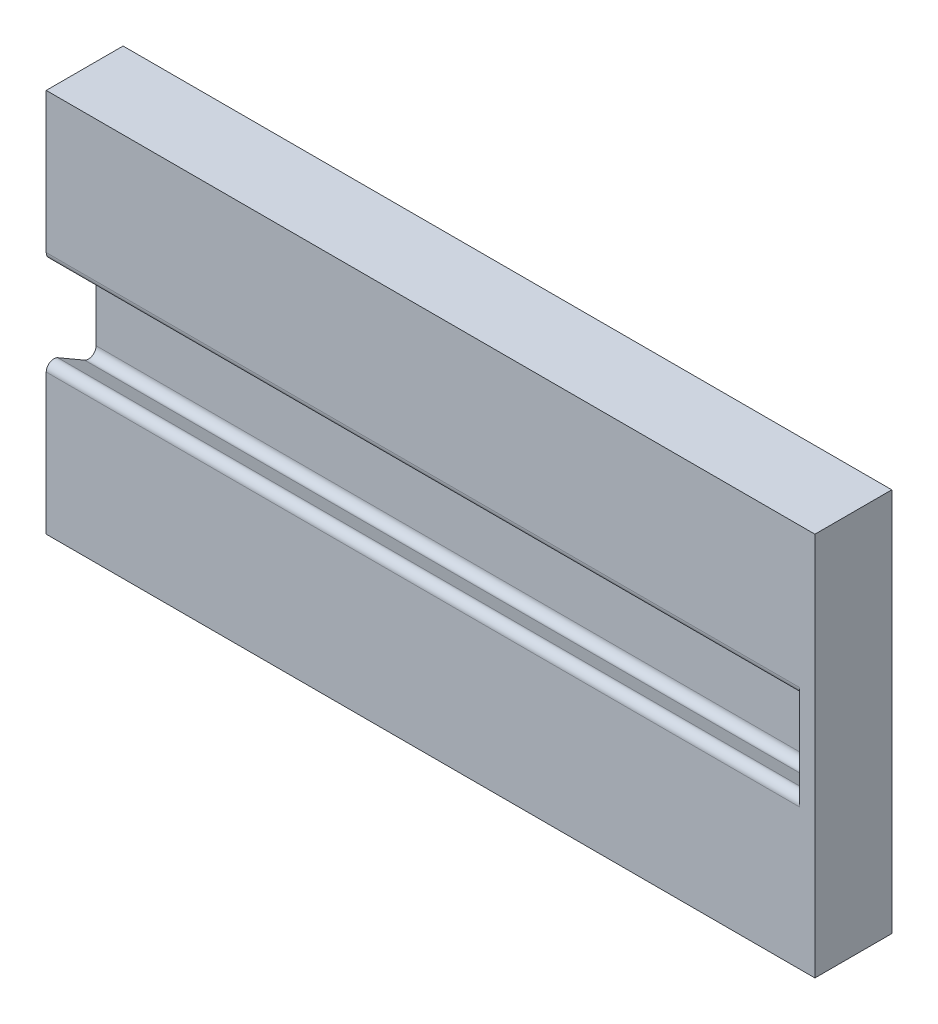
ISO-10303-21;
HEADER;
FILE_DESCRIPTION(('STEP AP214'),'2;1');
FILE_NAME('part.step','',(''),(''),'','','');
FILE_SCHEMA(('AUTOMOTIVE_DESIGN { 1 0 10303 214 1 1 1 1 }'));
ENDSEC;
DATA;
#1=APPLICATION_CONTEXT('core data for automotive mechanical design processes');
#2=APPLICATION_PROTOCOL_DEFINITION('international standard','automotive_design',2000,#1);
#3=PRODUCT_CONTEXT('',#1,'mechanical');
#4=PRODUCT('Part','Part','',(#3));
#5=PRODUCT_RELATED_PRODUCT_CATEGORY('part','',(#4));
#6=PRODUCT_DEFINITION_FORMATION('','',#4);
#7=PRODUCT_DEFINITION_CONTEXT('part definition',#1,'design');
#8=PRODUCT_DEFINITION('design','',#6,#7);
#9=PRODUCT_DEFINITION_SHAPE('','',#8);
#10=(LENGTH_UNIT() NAMED_UNIT(*) SI_UNIT(.MILLI.,.METRE.));
#11=(NAMED_UNIT(*) PLANE_ANGLE_UNIT() SI_UNIT($,.RADIAN.));
#12=(NAMED_UNIT(*) SI_UNIT($,.STERADIAN.) SOLID_ANGLE_UNIT());
#13=UNCERTAINTY_MEASURE_WITH_UNIT(LENGTH_MEASURE(1.E-05),#10,'distance_accuracy_value','');
#14=(GEOMETRIC_REPRESENTATION_CONTEXT(3) GLOBAL_UNCERTAINTY_ASSIGNED_CONTEXT((#13)) GLOBAL_UNIT_ASSIGNED_CONTEXT((#10,
#11,#12)) REPRESENTATION_CONTEXT('',''));
#15=CARTESIAN_POINT('',(0.,0.,0.));
#16=DIRECTION('',(0.,0.,1.));
#17=DIRECTION('',(1.,0.,0.));
#18=AXIS2_PLACEMENT_3D('',#15,#16,#17);
#19=CARTESIAN_POINT('',(50.,25.,10.));
#20=DIRECTION('',(-1.,0.,0.));
#21=DIRECTION('',(0.,-1.,0.));
#22=AXIS2_PLACEMENT_3D('',#19,#20,#21);
#23=PLANE('',#22);
#24=DIRECTION('',(0.,1.,0.));
#25=VECTOR('',#24,1.);
#26=CARTESIAN_POINT('',(50.,25.,0.));
#27=LINE('',#26,#25);
#28=CARTESIAN_POINT('',(50.,-25.,0.));
#29=VERTEX_POINT('',#28);
#30=CARTESIAN_POINT('',(50.,25.,0.));
#31=VERTEX_POINT('',#30);
#32=EDGE_CURVE('E145',#29,#31,#27,.T.);
#33=ORIENTED_EDGE('',*,*,#32,.T.);
#34=DIRECTION('',(0.,0.,-1.));
#35=VECTOR('',#34,1.);
#36=CARTESIAN_POINT('',(50.,25.,10.));
#37=LINE('',#36,#35);
#38=CARTESIAN_POINT('',(50.,25.,10.));
#39=VERTEX_POINT('',#38);
#40=EDGE_CURVE('E126',#39,#31,#37,.T.);
#41=ORIENTED_EDGE('',*,*,#40,.F.);
#42=DIRECTION('',(0.,1.,0.));
#43=VECTOR('',#42,1.);
#44=CARTESIAN_POINT('',(50.,25.,10.));
#45=LINE('',#44,#43);
#46=CARTESIAN_POINT('',(50.,-25.,10.));
#47=VERTEX_POINT('',#46);
#48=EDGE_CURVE('E133',#47,#39,#45,.T.);
#49=ORIENTED_EDGE('',*,*,#48,.F.);
#50=DIRECTION('',(0.,0.,-1.));
#51=VECTOR('',#50,1.);
#52=CARTESIAN_POINT('',(50.,-25.,10.));
#53=LINE('',#52,#51);
#54=EDGE_CURVE('E202',#47,#29,#53,.T.);
#55=ORIENTED_EDGE('',*,*,#54,.T.);
#56=EDGE_LOOP('',(#33,#41,#49,#55));
#57=FACE_BOUND('',#56,.T.);
#58=ADVANCED_FACE('F36',(#57),#23,.F.);
#59=CARTESIAN_POINT('',(-50.,25.,10.));
#60=DIRECTION('',(0.,-1.,0.));
#61=DIRECTION('',(0.,0.,-1.));
#62=AXIS2_PLACEMENT_3D('',#59,#60,#61);
#63=PLANE('',#62);
#64=DIRECTION('',(-1.,0.,0.));
#65=VECTOR('',#64,1.);
#66=CARTESIAN_POINT('',(-50.,25.,0.));
#67=LINE('',#66,#65);
#68=CARTESIAN_POINT('',(-50.,25.,0.));
#69=VERTEX_POINT('',#68);
#70=EDGE_CURVE('E204',#31,#69,#67,.T.);
#71=ORIENTED_EDGE('',*,*,#70,.T.);
#72=DIRECTION('',(0.,0.,-1.));
#73=VECTOR('',#72,1.);
#74=CARTESIAN_POINT('',(-50.,25.,10.));
#75=LINE('',#74,#73);
#76=CARTESIAN_POINT('',(-50.,25.,10.));
#77=VERTEX_POINT('',#76);
#78=EDGE_CURVE('E129',#77,#69,#75,.T.);
#79=ORIENTED_EDGE('',*,*,#78,.F.);
#80=DIRECTION('',(-1.,0.,0.));
#81=VECTOR('',#80,1.);
#82=CARTESIAN_POINT('',(-50.,25.,10.));
#83=LINE('',#82,#81);
#84=EDGE_CURVE('E122',#39,#77,#83,.T.);
#85=ORIENTED_EDGE('',*,*,#84,.F.);
#86=ORIENTED_EDGE('',*,*,#40,.T.);
#87=EDGE_LOOP('',(#71,#79,#85,#86));
#88=FACE_BOUND('',#87,.T.);
#89=ADVANCED_FACE('F124',(#88),#63,.F.);
#90=CARTESIAN_POINT('',(-50.,25.,10.));
#91=DIRECTION('',(1.,0.,0.));
#92=DIRECTION('',(0.,0.,-1.));
#93=AXIS2_PLACEMENT_3D('',#90,#91,#92);
#94=PLANE('',#93);
#95=DIRECTION('',(0.,-1.,0.));
#96=VECTOR('',#95,1.);
#97=CARTESIAN_POINT('',(-50.,25.,10.));
#98=LINE('',#97,#96);
#99=CARTESIAN_POINT('',(-50.,-6.73205080756889,10.));
#100=VERTEX_POINT('',#99);
#101=CARTESIAN_POINT('',(-50.,-25.,10.));
#102=VERTEX_POINT('',#101);
#103=EDGE_CURVE('E132',#100,#102,#98,.T.);
#104=ORIENTED_EDGE('',*,*,#103,.F.);
#105=CARTESIAN_POINT('',(-50.,-6.73205080756889,9.));
#106=DIRECTION('',(1.,0.,0.));
#107=DIRECTION('',(0.,0.,-1.));
#108=AXIS2_PLACEMENT_3D('',#105,#106,#107);
#109=CIRCLE('',#108,1.);
#110=CARTESIAN_POINT('',(-50.,-5.86602540378445,8.5));
#111=VERTEX_POINT('',#110);
#112=EDGE_CURVE('E176',#100,#111,#109,.F.);
#113=ORIENTED_EDGE('',*,*,#112,.T.);
#114=DIRECTION('',(0.,0.500000000000004,0.866025403784436));
#115=VECTOR('',#114,1.);
#116=CARTESIAN_POINT('',(-50.,-5.,10.));
#117=LINE('',#116,#115);
#118=CARTESIAN_POINT('',(-50.,-7.88397459621558,5.00480947161673));
#119=VERTEX_POINT('',#118);
#120=EDGE_CURVE('E231',#119,#111,#117,.T.);
#121=ORIENTED_EDGE('',*,*,#120,.F.);
#122=CARTESIAN_POINT('',(-50.,-7.01794919243115,4.50480947161673));
#123=DIRECTION('',(1.,0.,0.));
#124=DIRECTION('',(0.,0.,-1.));
#125=AXIS2_PLACEMENT_3D('',#122,#123,#124);
#126=CIRCLE('',#125,1.);
#127=CARTESIAN_POINT('',(-50.,-7.01794919243115,3.50480947161673));
#128=VERTEX_POINT('',#127);
#129=EDGE_CURVE('E178',#119,#128,#126,.T.);
#130=ORIENTED_EDGE('',*,*,#129,.T.);
#131=DIRECTION('',(0.,-1.,0.));
#132=VECTOR('',#131,1.);
#133=CARTESIAN_POINT('',(-50.,8.75000000000003,3.50480947161673));
#134=LINE('',#133,#132);
#135=CARTESIAN_POINT('',(-50.,7.01794919243114,3.50480947161673));
#136=VERTEX_POINT('',#135);
#137=EDGE_CURVE('E234',#136,#128,#134,.T.);
#138=ORIENTED_EDGE('',*,*,#137,.F.);
#139=CARTESIAN_POINT('',(-50.,7.01794919243114,4.50480947161673));
#140=DIRECTION('',(1.,0.,0.));
#141=DIRECTION('',(0.,0.,-1.));
#142=AXIS2_PLACEMENT_3D('',#139,#140,#141);
#143=CIRCLE('',#142,1.);
#144=CARTESIAN_POINT('',(-50.,7.88397459621558,5.00480947161673));
#145=VERTEX_POINT('',#144);
#146=EDGE_CURVE('E180',#136,#145,#143,.T.);
#147=ORIENTED_EDGE('',*,*,#146,.T.);
#148=DIRECTION('',(0.,0.500000000000004,-0.866025403784436));
#149=VECTOR('',#148,1.);
#150=CARTESIAN_POINT('',(-50.,5.,10.));
#151=LINE('',#150,#149);
#152=CARTESIAN_POINT('',(-50.,5.86602540378445,8.5));
#153=VERTEX_POINT('',#152);
#154=EDGE_CURVE('E237',#153,#145,#151,.T.);
#155=ORIENTED_EDGE('',*,*,#154,.F.);
#156=CARTESIAN_POINT('',(-50.,6.73205080756889,9.));
#157=DIRECTION('',(1.,0.,0.));
#158=DIRECTION('',(0.,0.,-1.));
#159=AXIS2_PLACEMENT_3D('',#156,#157,#158);
#160=CIRCLE('',#159,1.);
#161=CARTESIAN_POINT('',(-50.,6.73205080756889,10.));
#162=VERTEX_POINT('',#161);
#163=EDGE_CURVE('E174',#153,#162,#160,.F.);
#164=ORIENTED_EDGE('',*,*,#163,.T.);
#165=EDGE_CURVE('E198',#77,#162,#98,.T.);
#166=ORIENTED_EDGE('',*,*,#165,.F.);
#167=ORIENTED_EDGE('',*,*,#78,.T.);
#168=DIRECTION('',(0.,-1.,0.));
#169=VECTOR('',#168,1.);
#170=CARTESIAN_POINT('',(-50.,25.,0.));
#171=LINE('',#170,#169);
#172=CARTESIAN_POINT('',(-50.,-25.,0.));
#173=VERTEX_POINT('',#172);
#174=EDGE_CURVE('E207',#69,#173,#171,.T.);
#175=ORIENTED_EDGE('',*,*,#174,.T.);
#176=DIRECTION('',(0.,0.,-1.));
#177=VECTOR('',#176,1.);
#178=CARTESIAN_POINT('',(-50.,-25.,10.));
#179=LINE('',#178,#177);
#180=EDGE_CURVE('E150',#102,#173,#179,.T.);
#181=ORIENTED_EDGE('',*,*,#180,.F.);
#182=EDGE_LOOP('',(#104,#113,#121,#130,#138,#147,#155,#164,#166,#167,#175,#181));
#183=FACE_BOUND('',#182,.T.);
#184=ADVANCED_FACE('F194',(#183),#94,.F.);
#185=CARTESIAN_POINT('',(-50.,-25.,10.));
#186=DIRECTION('',(0.,1.,0.));
#187=DIRECTION('',(0.,0.,1.));
#188=AXIS2_PLACEMENT_3D('',#185,#186,#187);
#189=PLANE('',#188);
#190=DIRECTION('',(1.,0.,0.));
#191=VECTOR('',#190,1.);
#192=CARTESIAN_POINT('',(-50.,-25.,0.));
#193=LINE('',#192,#191);
#194=EDGE_CURVE('E142',#173,#29,#193,.T.);
#195=ORIENTED_EDGE('',*,*,#194,.T.);
#196=ORIENTED_EDGE('',*,*,#54,.F.);
#197=DIRECTION('',(1.,0.,0.));
#198=VECTOR('',#197,1.);
#199=CARTESIAN_POINT('',(-50.,-25.,10.));
#200=LINE('',#199,#198);
#201=EDGE_CURVE('E138',#102,#47,#200,.T.);
#202=ORIENTED_EDGE('',*,*,#201,.F.);
#203=ORIENTED_EDGE('',*,*,#180,.T.);
#204=EDGE_LOOP('',(#195,#196,#202,#203));
#205=FACE_BOUND('',#204,.T.);
#206=ADVANCED_FACE('F212',(#205),#189,.F.);
#207=CARTESIAN_POINT('',(0.,0.,10.));
#208=DIRECTION('',(0.,0.,1.));
#209=DIRECTION('',(1.,0.,0.));
#210=AXIS2_PLACEMENT_3D('',#207,#208,#209);
#211=PLANE('',#210);
#212=DIRECTION('',(0.,-1.,0.));
#213=VECTOR('',#212,1.);
#214=CARTESIAN_POINT('',(48.,-5.,10.));
#215=LINE('',#214,#213);
#216=CARTESIAN_POINT('',(48.,6.73205080756888,10.));
#217=VERTEX_POINT('',#216);
#218=CARTESIAN_POINT('',(48.,-6.73205080756889,10.));
#219=VERTEX_POINT('',#218);
#220=EDGE_CURVE('E51',#217,#219,#215,.T.);
#221=ORIENTED_EDGE('',*,*,#220,.T.);
#222=DIRECTION('',(-1.,0.,0.));
#223=VECTOR('',#222,1.);
#224=CARTESIAN_POINT('',(-50.,-6.73205080756889,10.));
#225=LINE('',#224,#223);
#226=EDGE_CURVE('E172',#219,#100,#225,.T.);
#227=ORIENTED_EDGE('',*,*,#226,.T.);
#228=ORIENTED_EDGE('',*,*,#103,.T.);
#229=ORIENTED_EDGE('',*,*,#201,.T.);
#230=ORIENTED_EDGE('',*,*,#48,.T.);
#231=ORIENTED_EDGE('',*,*,#84,.T.);
#232=ORIENTED_EDGE('',*,*,#165,.T.);
#233=DIRECTION('',(-1.,0.,0.));
#234=VECTOR('',#233,1.);
#235=CARTESIAN_POINT('',(48.,6.73205080756889,10.));
#236=LINE('',#235,#234);
#237=EDGE_CURVE('E170',#162,#217,#236,.F.);
#238=ORIENTED_EDGE('',*,*,#237,.T.);
#239=EDGE_LOOP('',(#221,#227,#228,#229,#230,#231,#232,#238));
#240=FACE_BOUND('',#239,.T.);
#241=ADVANCED_FACE('F136',(#240),#211,.T.);
#242=CARTESIAN_POINT('',(0.,0.,0.));
#243=DIRECTION('',(0.,0.,1.));
#244=DIRECTION('',(1.,0.,0.));
#245=AXIS2_PLACEMENT_3D('',#242,#243,#244);
#246=PLANE('',#245);
#247=ORIENTED_EDGE('',*,*,#32,.F.);
#248=ORIENTED_EDGE('',*,*,#194,.F.);
#249=ORIENTED_EDGE('',*,*,#174,.F.);
#250=ORIENTED_EDGE('',*,*,#70,.F.);
#251=EDGE_LOOP('',(#247,#248,#249,#250));
#252=FACE_BOUND('',#251,.T.);
#253=ADVANCED_FACE('F215',(#252),#246,.F.);
#254=CARTESIAN_POINT('',(68.6664806538352,-5.,10.));
#255=DIRECTION('',(0.,-0.866025403784436,0.500000000000004));
#256=DIRECTION('',(0.,-0.500000000000005,-0.866025403784436));
#257=AXIS2_PLACEMENT_3D('',#254,#255,#256);
#258=PLANE('',#257);
#259=DIRECTION('',(0.,-0.500000000000005,-0.866025403784436));
#260=VECTOR('',#259,1.);
#261=CARTESIAN_POINT('',(48.,-5.,10.));
#262=LINE('',#261,#260);
#263=CARTESIAN_POINT('',(48.,-5.86602540378445,8.5));
#264=VERTEX_POINT('',#263);
#265=CARTESIAN_POINT('',(48.,-7.88397459621558,5.00480947161673));
#266=VERTEX_POINT('',#265);
#267=EDGE_CURVE('E187',#264,#266,#262,.T.);
#268=ORIENTED_EDGE('',*,*,#267,.T.);
#269=DIRECTION('',(-1.,0.,0.));
#270=VECTOR('',#269,1.);
#271=CARTESIAN_POINT('',(-50.,-7.88397459621558,5.00480947161673));
#272=LINE('',#271,#270);
#273=EDGE_CURVE('E148',#266,#119,#272,.T.);
#274=ORIENTED_EDGE('',*,*,#273,.T.);
#275=ORIENTED_EDGE('',*,*,#120,.T.);
#276=DIRECTION('',(-1.,0.,0.));
#277=VECTOR('',#276,1.);
#278=CARTESIAN_POINT('',(48.,-5.86602540378445,8.5));
#279=LINE('',#278,#277);
#280=EDGE_CURVE('E146',#111,#264,#279,.F.);
#281=ORIENTED_EDGE('',*,*,#280,.T.);
#282=EDGE_LOOP('',(#268,#274,#275,#281));
#283=FACE_BOUND('',#282,.T.);
#284=ADVANCED_FACE('F253',(#283),#258,.F.);
#285=CARTESIAN_POINT('',(68.6664806538352,8.75000000000003,3.50480947161673));
#286=DIRECTION('',(0.,0.,-1.));
#287=DIRECTION('',(0.,1.,0.));
#288=AXIS2_PLACEMENT_3D('',#285,#286,#287);
#289=PLANE('',#288);
#290=ORIENTED_EDGE('',*,*,#137,.T.);
#291=DIRECTION('',(-1.,0.,0.));
#292=VECTOR('',#291,1.);
#293=CARTESIAN_POINT('',(48.,-7.01794919243115,3.50480947161673));
#294=LINE('',#293,#292);
#295=CARTESIAN_POINT('',(48.,-7.01794919243115,3.50480947161673));
#296=VERTEX_POINT('',#295);
#297=EDGE_CURVE('E159',#128,#296,#294,.F.);
#298=ORIENTED_EDGE('',*,*,#297,.T.);
#299=DIRECTION('',(0.,1.,0.));
#300=VECTOR('',#299,1.);
#301=CARTESIAN_POINT('',(48.,8.75000000000003,3.50480947161673));
#302=LINE('',#301,#300);
#303=CARTESIAN_POINT('',(48.,7.01794919243114,3.50480947161673));
#304=VERTEX_POINT('',#303);
#305=EDGE_CURVE('E233',#296,#304,#302,.T.);
#306=ORIENTED_EDGE('',*,*,#305,.T.);
#307=DIRECTION('',(-1.,0.,0.));
#308=VECTOR('',#307,1.);
#309=CARTESIAN_POINT('',(-50.,7.01794919243114,3.50480947161673));
#310=LINE('',#309,#308);
#311=EDGE_CURVE('E156',#304,#136,#310,.T.);
#312=ORIENTED_EDGE('',*,*,#311,.T.);
#313=EDGE_LOOP('',(#290,#298,#306,#312));
#314=FACE_BOUND('',#313,.T.);
#315=ADVANCED_FACE('F243',(#314),#289,.F.);
#316=CARTESIAN_POINT('',(68.6664806538352,5.,10.));
#317=DIRECTION('',(0.,0.866025403784436,0.500000000000004));
#318=DIRECTION('',(0.,-0.500000000000004,0.866025403784436));
#319=AXIS2_PLACEMENT_3D('',#316,#317,#318);
#320=PLANE('',#319);
#321=ORIENTED_EDGE('',*,*,#154,.T.);
#322=DIRECTION('',(-1.,0.,0.));
#323=VECTOR('',#322,1.);
#324=CARTESIAN_POINT('',(48.,7.88397459621558,5.00480947161673));
#325=LINE('',#324,#323);
#326=CARTESIAN_POINT('',(48.,7.88397459621558,5.00480947161673));
#327=VERTEX_POINT('',#326);
#328=EDGE_CURVE('E168',#145,#327,#325,.F.);
#329=ORIENTED_EDGE('',*,*,#328,.T.);
#330=DIRECTION('',(0.,-0.500000000000004,0.866025403784436));
#331=VECTOR('',#330,1.);
#332=CARTESIAN_POINT('',(48.,5.,10.));
#333=LINE('',#332,#331);
#334=CARTESIAN_POINT('',(48.,5.86602540378445,8.5));
#335=VERTEX_POINT('',#334);
#336=EDGE_CURVE('E205',#327,#335,#333,.T.);
#337=ORIENTED_EDGE('',*,*,#336,.T.);
#338=DIRECTION('',(-1.,0.,0.));
#339=VECTOR('',#338,1.);
#340=CARTESIAN_POINT('',(-50.,5.86602540378445,8.5));
#341=LINE('',#340,#339);
#342=EDGE_CURVE('E165',#335,#153,#341,.T.);
#343=ORIENTED_EDGE('',*,*,#342,.T.);
#344=EDGE_LOOP('',(#321,#329,#337,#343));
#345=FACE_BOUND('',#344,.T.);
#346=ADVANCED_FACE('F226',(#345),#320,.F.);
#347=CARTESIAN_POINT('',(48.,25.,10.));
#348=DIRECTION('',(-1.,0.,0.));
#349=DIRECTION('',(0.,-1.,0.));
#350=AXIS2_PLACEMENT_3D('',#347,#348,#349);
#351=PLANE('',#350);
#352=ORIENTED_EDGE('',*,*,#305,.F.);
#353=CARTESIAN_POINT('',(48.,-7.01794919243115,4.50480947161673));
#354=DIRECTION('',(-1.,0.,0.));
#355=DIRECTION('',(0.,-1.,0.));
#356=AXIS2_PLACEMENT_3D('',#353,#354,#355);
#357=CIRCLE('',#356,1.);
#358=EDGE_CURVE('E163',#296,#266,#357,.T.);
#359=ORIENTED_EDGE('',*,*,#358,.T.);
#360=ORIENTED_EDGE('',*,*,#267,.F.);
#361=CARTESIAN_POINT('',(48.,-6.73205080756889,9.));
#362=DIRECTION('',(-1.,0.,0.));
#363=DIRECTION('',(0.,-1.,0.));
#364=AXIS2_PLACEMENT_3D('',#361,#362,#363);
#365=CIRCLE('',#364,1.);
#366=EDGE_CURVE('E44',#264,#219,#365,.F.);
#367=ORIENTED_EDGE('',*,*,#366,.T.);
#368=ORIENTED_EDGE('',*,*,#220,.F.);
#369=CARTESIAN_POINT('',(48.,6.73205080756889,9.));
#370=DIRECTION('',(-1.,0.,0.));
#371=DIRECTION('',(0.,-1.,0.));
#372=AXIS2_PLACEMENT_3D('',#369,#370,#371);
#373=CIRCLE('',#372,1.);
#374=EDGE_CURVE('E12',#217,#335,#373,.F.);
#375=ORIENTED_EDGE('',*,*,#374,.T.);
#376=ORIENTED_EDGE('',*,*,#336,.F.);
#377=CARTESIAN_POINT('',(48.,7.01794919243114,4.50480947161673));
#378=DIRECTION('',(-1.,0.,0.));
#379=DIRECTION('',(0.,-1.,0.));
#380=AXIS2_PLACEMENT_3D('',#377,#378,#379);
#381=CIRCLE('',#380,1.);
#382=EDGE_CURVE('E161',#327,#304,#381,.T.);
#383=ORIENTED_EDGE('',*,*,#382,.T.);
#384=EDGE_LOOP('',(#352,#359,#360,#367,#368,#375,#376,#383));
#385=FACE_BOUND('',#384,.T.);
#386=ADVANCED_FACE('F185',(#385),#351,.T.);
#387=CARTESIAN_POINT('',(68.6664806538352,-7.01794919243115,4.50480947161673));
#388=DIRECTION('',(1.,0.,0.));
#389=DIRECTION('',(0.,0.,-1.));
#390=AXIS2_PLACEMENT_3D('',#387,#388,#389);
#391=CYLINDRICAL_SURFACE('',#390,1.);
#392=ORIENTED_EDGE('',*,*,#358,.F.);
#393=ORIENTED_EDGE('',*,*,#297,.F.);
#394=ORIENTED_EDGE('',*,*,#129,.F.);
#395=ORIENTED_EDGE('',*,*,#273,.F.);
#396=EDGE_LOOP('',(#392,#393,#394,#395));
#397=FACE_BOUND('',#396,.T.);
#398=ADVANCED_FACE('F250',(#397),#391,.F.);
#399=CARTESIAN_POINT('',(68.6664806538352,7.01794919243114,4.50480947161673));
#400=DIRECTION('',(1.,0.,0.));
#401=DIRECTION('',(0.,0.,-1.));
#402=AXIS2_PLACEMENT_3D('',#399,#400,#401);
#403=CYLINDRICAL_SURFACE('',#402,1.);
#404=ORIENTED_EDGE('',*,*,#382,.F.);
#405=ORIENTED_EDGE('',*,*,#328,.F.);
#406=ORIENTED_EDGE('',*,*,#146,.F.);
#407=ORIENTED_EDGE('',*,*,#311,.F.);
#408=EDGE_LOOP('',(#404,#405,#406,#407));
#409=FACE_BOUND('',#408,.T.);
#410=ADVANCED_FACE('F248',(#409),#403,.F.);
#411=CARTESIAN_POINT('',(0.,-6.73205080756889,9.));
#412=DIRECTION('',(1.,0.,0.));
#413=DIRECTION('',(0.,0.,-1.));
#414=AXIS2_PLACEMENT_3D('',#411,#412,#413);
#415=CYLINDRICAL_SURFACE('',#414,1.);
#416=ORIENTED_EDGE('',*,*,#366,.F.);
#417=ORIENTED_EDGE('',*,*,#280,.F.);
#418=ORIENTED_EDGE('',*,*,#112,.F.);
#419=ORIENTED_EDGE('',*,*,#226,.F.);
#420=EDGE_LOOP('',(#416,#417,#418,#419));
#421=FACE_BOUND('',#420,.T.);
#422=ADVANCED_FACE('F190',(#421),#415,.T.);
#423=CARTESIAN_POINT('',(68.6664806538352,6.73205080756889,9.));
#424=DIRECTION('',(1.,0.,0.));
#425=DIRECTION('',(0.,0.,-1.));
#426=AXIS2_PLACEMENT_3D('',#423,#424,#425);
#427=CYLINDRICAL_SURFACE('',#426,1.);
#428=ORIENTED_EDGE('',*,*,#374,.F.);
#429=ORIENTED_EDGE('',*,*,#237,.F.);
#430=ORIENTED_EDGE('',*,*,#163,.F.);
#431=ORIENTED_EDGE('',*,*,#342,.F.);
#432=EDGE_LOOP('',(#428,#429,#430,#431));
#433=FACE_BOUND('',#432,.T.);
#434=ADVANCED_FACE('F38',(#433),#427,.T.);
#435=CLOSED_SHELL('',(#58,#89,#184,#206,#241,#253,#284,#315,#346,#386,#398,#410,#422,#434));
#436=MANIFOLD_SOLID_BREP('B2',#435);
#437=ADVANCED_BREP_SHAPE_REPRESENTATION('',(#18,#436),#14);
#438=SHAPE_DEFINITION_REPRESENTATION(#9,#437);
ENDSEC;
END-ISO-10303-21;
